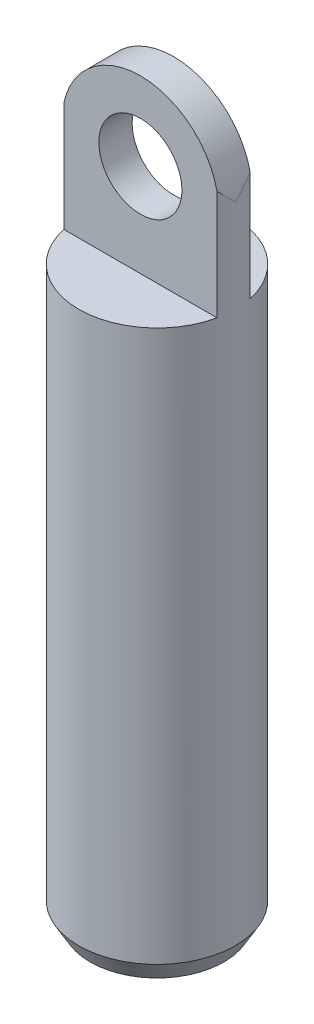
ISO-10303-21;
HEADER;
FILE_DESCRIPTION(('STEP AP214'),'2;1');
FILE_NAME('part.step','',(''),(''),'','','');
FILE_SCHEMA(('AUTOMOTIVE_DESIGN { 1 0 10303 214 1 1 1 1 }'));
ENDSEC;
DATA;
#1=APPLICATION_CONTEXT('core data for automotive mechanical design processes');
#2=APPLICATION_PROTOCOL_DEFINITION('international standard','automotive_design',2000,#1);
#3=PRODUCT_CONTEXT('',#1,'mechanical');
#4=PRODUCT('Part','Part','',(#3));
#5=PRODUCT_RELATED_PRODUCT_CATEGORY('part','',(#4));
#6=PRODUCT_DEFINITION_FORMATION('','',#4);
#7=PRODUCT_DEFINITION_CONTEXT('part definition',#1,'design');
#8=PRODUCT_DEFINITION('design','',#6,#7);
#9=PRODUCT_DEFINITION_SHAPE('','',#8);
#10=(LENGTH_UNIT() NAMED_UNIT(*) SI_UNIT(.MILLI.,.METRE.));
#11=(NAMED_UNIT(*) PLANE_ANGLE_UNIT() SI_UNIT($,.RADIAN.));
#12=(NAMED_UNIT(*) SI_UNIT($,.STERADIAN.) SOLID_ANGLE_UNIT());
#13=UNCERTAINTY_MEASURE_WITH_UNIT(LENGTH_MEASURE(1.E-05),#10,'distance_accuracy_value','');
#14=(GEOMETRIC_REPRESENTATION_CONTEXT(3) GLOBAL_UNCERTAINTY_ASSIGNED_CONTEXT((#13)) GLOBAL_UNIT_ASSIGNED_CONTEXT((#10,
#11,#12)) REPRESENTATION_CONTEXT('',''));
#15=CARTESIAN_POINT('',(0.,0.,0.));
#16=DIRECTION('',(0.,0.,1.));
#17=DIRECTION('',(1.,0.,0.));
#18=AXIS2_PLACEMENT_3D('',#15,#16,#17);
#19=CARTESIAN_POINT('',(0.,14.1986,0.));
#20=DIRECTION('',(0.,-1.,0.));
#21=DIRECTION('',(0.,0.,-1.));
#22=AXIS2_PLACEMENT_3D('',#19,#20,#21);
#23=CYLINDRICAL_SURFACE('',#22,2.9972);
#24=CARTESIAN_POINT('',(0.,-13.4366,0.));
#25=DIRECTION('',(0.,1.,0.));
#26=DIRECTION('',(0.,0.,1.));
#27=AXIS2_PLACEMENT_3D('',#24,#25,#26);
#28=CIRCLE('',#27,2.9972);
#29=CARTESIAN_POINT('',(0.,-13.4366,2.9972));
#30=VERTEX_POINT('',#29);
#31=EDGE_CURVE('E24',#30,#30,#28,.T.);
#32=ORIENTED_EDGE('',*,*,#31,.T.);
#33=EDGE_LOOP('',(#32));
#34=FACE_BOUND('',#33,.T.);
#35=DIRECTION('',(0.,-1.,0.));
#36=VECTOR('',#35,1.);
#37=CARTESIAN_POINT('',(2.92916077401019,14.1986,0.635));
#38=LINE('',#37,#36);
#39=CARTESIAN_POINT('',(2.92916077401019,11.8364,0.635));
#40=VERTEX_POINT('',#39);
#41=CARTESIAN_POINT('',(2.92916077401019,7.6454,0.635));
#42=VERTEX_POINT('',#41);
#43=EDGE_CURVE('E31',#40,#42,#38,.T.);
#44=ORIENTED_EDGE('',*,*,#43,.T.);
#45=CARTESIAN_POINT('',(0.,7.6454,0.));
#46=DIRECTION('',(0.,-1.,0.));
#47=DIRECTION('',(0.,0.,-1.));
#48=AXIS2_PLACEMENT_3D('',#45,#46,#47);
#49=CIRCLE('',#48,2.9972);
#50=CARTESIAN_POINT('',(-2.92916077401019,7.6454,0.635));
#51=VERTEX_POINT('',#50);
#52=EDGE_CURVE('E117',#42,#51,#49,.T.);
#53=ORIENTED_EDGE('',*,*,#52,.T.);
#54=DIRECTION('',(0.,-1.,0.));
#55=VECTOR('',#54,1.);
#56=CARTESIAN_POINT('',(-2.92916077401019,14.1986,0.635));
#57=LINE('',#56,#55);
#58=CARTESIAN_POINT('',(-2.92916077401019,11.8364,0.635));
#59=VERTEX_POINT('',#58);
#60=EDGE_CURVE('E92',#51,#59,#57,.F.);
#61=ORIENTED_EDGE('',*,*,#60,.T.);
#62=CARTESIAN_POINT('',(0.,11.2014,0.));
#63=DIRECTION('',(0.,-0.707106781186547,0.707106781186547));
#64=DIRECTION('',(0.,-0.707106781186547,-0.707106781186547));
#65=AXIS2_PLACEMENT_3D('',#62,#63,#64);
#66=ELLIPSE('',#65,4.23868088914464,2.9972);
#67=CARTESIAN_POINT('',(-2.9972,11.2014,0.));
#68=VERTEX_POINT('',#67);
#69=EDGE_CURVE('E103',#59,#68,#66,.T.);
#70=ORIENTED_EDGE('',*,*,#69,.T.);
#71=CARTESIAN_POINT('',(0.,11.2014,0.));
#72=DIRECTION('',(0.,-0.707106781186547,-0.707106781186547));
#73=DIRECTION('',(0.,-0.707106781186547,0.707106781186547));
#74=AXIS2_PLACEMENT_3D('',#71,#72,#73);
#75=ELLIPSE('',#74,4.23868088914464,2.9972);
#76=CARTESIAN_POINT('',(-2.92916077401019,11.8364,-0.635));
#77=VERTEX_POINT('',#76);
#78=EDGE_CURVE('E108',#68,#77,#75,.T.);
#79=ORIENTED_EDGE('',*,*,#78,.T.);
#80=DIRECTION('',(0.,-1.,0.));
#81=VECTOR('',#80,1.);
#82=CARTESIAN_POINT('',(-2.92916077401019,14.1986,-0.635));
#83=LINE('',#82,#81);
#84=CARTESIAN_POINT('',(-2.92916077401019,7.6454,-0.635));
#85=VERTEX_POINT('',#84);
#86=EDGE_CURVE('E39',#77,#85,#83,.T.);
#87=ORIENTED_EDGE('',*,*,#86,.T.);
#88=CARTESIAN_POINT('',(0.,7.6454,0.));
#89=DIRECTION('',(0.,1.,0.));
#90=DIRECTION('',(0.,0.,1.));
#91=AXIS2_PLACEMENT_3D('',#88,#89,#90);
#92=CIRCLE('',#91,2.9972);
#93=CARTESIAN_POINT('',(2.92916077401019,7.6454,-0.635));
#94=VERTEX_POINT('',#93);
#95=EDGE_CURVE('E113',#94,#85,#92,.T.);
#96=ORIENTED_EDGE('',*,*,#95,.F.);
#97=DIRECTION('',(0.,-1.,0.));
#98=VECTOR('',#97,1.);
#99=CARTESIAN_POINT('',(2.92916077401019,14.1986,-0.635));
#100=LINE('',#99,#98);
#101=CARTESIAN_POINT('',(2.92916077401019,11.8364,-0.635));
#102=VERTEX_POINT('',#101);
#103=EDGE_CURVE('E99',#94,#102,#100,.F.);
#104=ORIENTED_EDGE('',*,*,#103,.T.);
#105=CARTESIAN_POINT('',(2.9972,11.2014,0.));
#106=VERTEX_POINT('',#105);
#107=EDGE_CURVE('E107',#102,#106,#75,.T.);
#108=ORIENTED_EDGE('',*,*,#107,.T.);
#109=EDGE_CURVE('E104',#106,#40,#66,.T.);
#110=ORIENTED_EDGE('',*,*,#109,.T.);
#111=EDGE_LOOP('',(#44,#53,#61,#70,#79,#87,#96,#104,#108,#110));
#112=FACE_BOUND('',#111,.T.);
#113=ADVANCED_FACE('F16',(#34,#112),#23,.T.);
#114=CARTESIAN_POINT('',(0.,-14.1986,0.));
#115=DIRECTION('',(0.,1.,0.));
#116=DIRECTION('',(0.,0.,1.));
#117=AXIS2_PLACEMENT_3D('',#114,#115,#116);
#118=PLANE('',#117);
#119=CARTESIAN_POINT('',(0.,-14.1986,0.));
#120=DIRECTION('',(0.,-1.,0.));
#121=DIRECTION('',(0.,0.,-1.));
#122=AXIS2_PLACEMENT_3D('',#119,#120,#121);
#123=CIRCLE('',#122,1.4224);
#124=CARTESIAN_POINT('',(0.,-14.1986,-1.4224));
#125=VERTEX_POINT('',#124);
#126=EDGE_CURVE('E83',#125,#125,#123,.T.);
#127=ORIENTED_EDGE('',*,*,#126,.F.);
#128=EDGE_LOOP('',(#127));
#129=FACE_BOUND('',#128,.T.);
#130=CARTESIAN_POINT('',(0.,-14.1986,0.));
#131=DIRECTION('',(0.,1.,0.));
#132=DIRECTION('',(0.,0.,1.));
#133=AXIS2_PLACEMENT_3D('',#130,#131,#132);
#134=CIRCLE('',#133,2.55725909487751);
#135=CARTESIAN_POINT('',(0.,-14.1986,2.55725909487751));
#136=VERTEX_POINT('',#135);
#137=EDGE_CURVE('E11',#136,#136,#134,.F.);
#138=ORIENTED_EDGE('',*,*,#137,.T.);
#139=EDGE_LOOP('',(#138));
#140=FACE_BOUND('',#139,.T.);
#141=ADVANCED_FACE('F143',(#129,#140),#118,.F.);
#142=CARTESIAN_POINT('',(0.,11.2014,28.3972));
#143=DIRECTION('',(0.,0.,-1.));
#144=DIRECTION('',(-1.,0.,0.));
#145=AXIS2_PLACEMENT_3D('',#142,#143,#144);
#146=CYLINDRICAL_SURFACE('',#145,2.9972);
#147=ORIENTED_EDGE('',*,*,#69,.F.);
#148=CARTESIAN_POINT('',(0.,11.2014,0.635));
#149=DIRECTION('',(0.,0.,-1.));
#150=DIRECTION('',(-1.,0.,0.));
#151=AXIS2_PLACEMENT_3D('',#148,#149,#150);
#152=CIRCLE('',#151,2.9972);
#153=EDGE_CURVE('E115',#59,#40,#152,.T.);
#154=ORIENTED_EDGE('',*,*,#153,.T.);
#155=ORIENTED_EDGE('',*,*,#109,.F.);
#156=ORIENTED_EDGE('',*,*,#107,.F.);
#157=CARTESIAN_POINT('',(0.,11.2014,-0.635));
#158=DIRECTION('',(0.,0.,1.));
#159=DIRECTION('',(1.,0.,0.));
#160=AXIS2_PLACEMENT_3D('',#157,#158,#159);
#161=CIRCLE('',#160,2.9972);
#162=EDGE_CURVE('E111',#102,#77,#161,.T.);
#163=ORIENTED_EDGE('',*,*,#162,.T.);
#164=ORIENTED_EDGE('',*,*,#78,.F.);
#165=EDGE_LOOP('',(#147,#154,#155,#156,#163,#164));
#166=FACE_BOUND('',#165,.T.);
#167=ADVANCED_FACE('F147',(#166),#146,.T.);
#168=CARTESIAN_POINT('',(0.,7.6454,-0.635));
#169=DIRECTION('',(0.,1.,0.));
#170=DIRECTION('',(0.,0.,1.));
#171=AXIS2_PLACEMENT_3D('',#168,#169,#170);
#172=PLANE('',#171);
#173=DIRECTION('',(1.,0.,0.));
#174=VECTOR('',#173,1.);
#175=CARTESIAN_POINT('',(0.,7.6454,-0.635));
#176=LINE('',#175,#174);
#177=EDGE_CURVE('E96',#85,#94,#176,.T.);
#178=ORIENTED_EDGE('',*,*,#177,.T.);
#179=ORIENTED_EDGE('',*,*,#95,.T.);
#180=EDGE_LOOP('',(#178,#179));
#181=FACE_BOUND('',#180,.T.);
#182=ADVANCED_FACE('F153',(#181),#172,.T.);
#183=CARTESIAN_POINT('',(0.,2.96326821784253,-0.635));
#184=DIRECTION('',(0.,0.,1.));
#185=DIRECTION('',(1.,0.,0.));
#186=AXIS2_PLACEMENT_3D('',#183,#184,#185);
#187=PLANE('',#186);
#188=CARTESIAN_POINT('',(0.,11.2014,-0.635));
#189=DIRECTION('',(0.,0.,-1.));
#190=DIRECTION('',(-1.,0.,0.));
#191=AXIS2_PLACEMENT_3D('',#188,#189,#190);
#192=CIRCLE('',#191,1.5875);
#193=CARTESIAN_POINT('',(-1.5875,11.2014,-0.635));
#194=VERTEX_POINT('',#193);
#195=EDGE_CURVE('E86',#194,#194,#192,.T.);
#196=ORIENTED_EDGE('',*,*,#195,.F.);
#197=EDGE_LOOP('',(#196));
#198=FACE_BOUND('',#197,.T.);
#199=ORIENTED_EDGE('',*,*,#162,.F.);
#200=ORIENTED_EDGE('',*,*,#103,.F.);
#201=ORIENTED_EDGE('',*,*,#177,.F.);
#202=ORIENTED_EDGE('',*,*,#86,.F.);
#203=EDGE_LOOP('',(#199,#200,#201,#202));
#204=FACE_BOUND('',#203,.T.);
#205=ADVANCED_FACE('F157',(#198,#204),#187,.F.);
#206=CARTESIAN_POINT('',(0.,7.6454,0.635));
#207=DIRECTION('',(0.,-1.,0.));
#208=DIRECTION('',(0.,0.,-1.));
#209=AXIS2_PLACEMENT_3D('',#206,#207,#208);
#210=PLANE('',#209);
#211=DIRECTION('',(1.,0.,0.));
#212=VECTOR('',#211,1.);
#213=CARTESIAN_POINT('',(0.,7.6454,0.635));
#214=LINE('',#213,#212);
#215=EDGE_CURVE('E90',#51,#42,#214,.T.);
#216=ORIENTED_EDGE('',*,*,#215,.F.);
#217=ORIENTED_EDGE('',*,*,#52,.F.);
#218=EDGE_LOOP('',(#216,#217));
#219=FACE_BOUND('',#218,.T.);
#220=ADVANCED_FACE('F161',(#219),#210,.F.);
#221=CARTESIAN_POINT('',(0.,2.96326821784253,0.635));
#222=DIRECTION('',(0.,0.,-1.));
#223=DIRECTION('',(1.,0.,0.));
#224=AXIS2_PLACEMENT_3D('',#221,#222,#223);
#225=PLANE('',#224);
#226=CARTESIAN_POINT('',(0.,11.2014,0.635));
#227=DIRECTION('',(0.,0.,-1.));
#228=DIRECTION('',(-1.,0.,0.));
#229=AXIS2_PLACEMENT_3D('',#226,#227,#228);
#230=CIRCLE('',#229,1.5875);
#231=CARTESIAN_POINT('',(-1.5875,11.2014,0.635));
#232=VERTEX_POINT('',#231);
#233=EDGE_CURVE('E89',#232,#232,#230,.T.);
#234=ORIENTED_EDGE('',*,*,#233,.T.);
#235=EDGE_LOOP('',(#234));
#236=FACE_BOUND('',#235,.T.);
#237=ORIENTED_EDGE('',*,*,#153,.F.);
#238=ORIENTED_EDGE('',*,*,#60,.F.);
#239=ORIENTED_EDGE('',*,*,#215,.T.);
#240=ORIENTED_EDGE('',*,*,#43,.F.);
#241=EDGE_LOOP('',(#237,#238,#239,#240));
#242=FACE_BOUND('',#241,.T.);
#243=ADVANCED_FACE('F138',(#236,#242),#225,.F.);
#244=CARTESIAN_POINT('',(0.,11.2014,2.9972));
#245=DIRECTION('',(0.,0.,-1.));
#246=DIRECTION('',(-1.,0.,0.));
#247=AXIS2_PLACEMENT_3D('',#244,#245,#246);
#248=CYLINDRICAL_SURFACE('',#247,1.5875);
#249=CARTESIAN_POINT('',(-1.5875,11.2014,-0.635));
#250=CARTESIAN_POINT('',(-1.5875,11.2014,-0.621770833333333));
#251=CARTESIAN_POINT('',(-1.5875,11.2014,-0.608541666666667));
#252=CARTESIAN_POINT('',(-1.5875,11.2014,-0.582083333333333));
#253=CARTESIAN_POINT('',(-1.5875,11.2014,-0.568854166666666));
#254=CARTESIAN_POINT('',(-1.5875,11.2014,-0.542395833333333));
#255=CARTESIAN_POINT('',(-1.5875,11.2014,-0.529166666666666));
#256=CARTESIAN_POINT('',(-1.5875,11.2014,-0.502708333333333));
#257=CARTESIAN_POINT('',(-1.5875,11.2014,-0.489479166666666));
#258=CARTESIAN_POINT('',(-1.5875,11.2014,-0.463020833333333));
#259=CARTESIAN_POINT('',(-1.5875,11.2014,-0.449791666666666));
#260=CARTESIAN_POINT('',(-1.5875,11.2014,-0.423333333333333));
#261=CARTESIAN_POINT('',(-1.5875,11.2014,-0.410104166666666));
#262=CARTESIAN_POINT('',(-1.5875,11.2014,-0.383645833333333));
#263=CARTESIAN_POINT('',(-1.5875,11.2014,-0.370416666666666));
#264=CARTESIAN_POINT('',(-1.5875,11.2014,-0.343958333333333));
#265=CARTESIAN_POINT('',(-1.5875,11.2014,-0.330729166666666));
#266=CARTESIAN_POINT('',(-1.5875,11.2014,-0.304270833333333));
#267=CARTESIAN_POINT('',(-1.5875,11.2014,-0.291041666666666));
#268=CARTESIAN_POINT('',(-1.5875,11.2014,-0.264583333333333));
#269=CARTESIAN_POINT('',(-1.5875,11.2014,-0.251354166666667));
#270=CARTESIAN_POINT('',(-1.5875,11.2014,-0.224895833333333));
#271=CARTESIAN_POINT('',(-1.5875,11.2014,-0.211666666666667));
#272=CARTESIAN_POINT('',(-1.5875,11.2014,-0.185208333333333));
#273=CARTESIAN_POINT('',(-1.5875,11.2014,-0.171979166666667));
#274=CARTESIAN_POINT('',(-1.5875,11.2014,-0.145520833333333));
#275=CARTESIAN_POINT('',(-1.5875,11.2014,-0.132291666666667));
#276=CARTESIAN_POINT('',(-1.5875,11.2014,-0.105833333333333));
#277=CARTESIAN_POINT('',(-1.5875,11.2014,-0.0926041666666666));
#278=CARTESIAN_POINT('',(-1.5875,11.2014,-0.0661458333333334));
#279=CARTESIAN_POINT('',(-1.5875,11.2014,-0.0529166666666668));
#280=CARTESIAN_POINT('',(-1.5875,11.2014,-0.0264583333333335));
#281=CARTESIAN_POINT('',(-1.5875,11.2014,-0.0132291666666667));
#282=CARTESIAN_POINT('',(-1.5875,11.2014,0.0132291666666667));
#283=CARTESIAN_POINT('',(-1.5875,11.2014,0.0264583333333335));
#284=CARTESIAN_POINT('',(-1.5875,11.2014,0.0529166666666668));
#285=CARTESIAN_POINT('',(-1.5875,11.2014,0.0661458333333334));
#286=CARTESIAN_POINT('',(-1.5875,11.2014,0.0926041666666666));
#287=CARTESIAN_POINT('',(-1.5875,11.2014,0.105833333333333));
#288=CARTESIAN_POINT('',(-1.5875,11.2014,0.132291666666667));
#289=CARTESIAN_POINT('',(-1.5875,11.2014,0.145520833333333));
#290=CARTESIAN_POINT('',(-1.5875,11.2014,0.171979166666667));
#291=CARTESIAN_POINT('',(-1.5875,11.2014,0.185208333333333));
#292=CARTESIAN_POINT('',(-1.5875,11.2014,0.211666666666667));
#293=CARTESIAN_POINT('',(-1.5875,11.2014,0.224895833333333));
#294=CARTESIAN_POINT('',(-1.5875,11.2014,0.251354166666667));
#295=CARTESIAN_POINT('',(-1.5875,11.2014,0.264583333333333));
#296=CARTESIAN_POINT('',(-1.5875,11.2014,0.291041666666666));
#297=CARTESIAN_POINT('',(-1.5875,11.2014,0.304270833333333));
#298=CARTESIAN_POINT('',(-1.5875,11.2014,0.330729166666666));
#299=CARTESIAN_POINT('',(-1.5875,11.2014,0.343958333333333));
#300=CARTESIAN_POINT('',(-1.5875,11.2014,0.370416666666667));
#301=CARTESIAN_POINT('',(-1.5875,11.2014,0.383645833333333));
#302=CARTESIAN_POINT('',(-1.5875,11.2014,0.410104166666667));
#303=CARTESIAN_POINT('',(-1.5875,11.2014,0.423333333333333));
#304=CARTESIAN_POINT('',(-1.5875,11.2014,0.449791666666666));
#305=CARTESIAN_POINT('',(-1.5875,11.2014,0.463020833333333));
#306=CARTESIAN_POINT('',(-1.5875,11.2014,0.489479166666666));
#307=CARTESIAN_POINT('',(-1.5875,11.2014,0.502708333333333));
#308=CARTESIAN_POINT('',(-1.5875,11.2014,0.529166666666666));
#309=CARTESIAN_POINT('',(-1.5875,11.2014,0.542395833333333));
#310=CARTESIAN_POINT('',(-1.5875,11.2014,0.568854166666666));
#311=CARTESIAN_POINT('',(-1.5875,11.2014,0.582083333333333));
#312=CARTESIAN_POINT('',(-1.5875,11.2014,0.608541666666667));
#313=CARTESIAN_POINT('',(-1.5875,11.2014,0.621770833333333));
#314=CARTESIAN_POINT('',(-1.5875,11.2014,0.635));
#315=B_SPLINE_CURVE_WITH_KNOTS('',3,(#249,#250,#251,#252,#253,#254,#255,#256,#257,#258,#259,
#260,#261,#262,#263,#264,#265,#266,#267,#268,#269,#270,#271,#272,#273,#274,#275,#276,#277,#278,
#279,#280,#281,#282,#283,#284,#285,#286,#287,#288,#289,#290,#291,#292,#293,#294,#295,#296,#297,
#298,#299,#300,#301,#302,#303,#304,#305,#306,#307,#308,#309,#310,#311,#312,#313,#314),
.UNSPECIFIED.,.F.,.F.,(4,2,2,2,2,2,2,2,2,2,2,2,2,2,2,2,2,2,2,2,2,2,2,2,2,2,2,2,2,2,2,2,4),(0.,
0.0396874999999998,0.079375,0.1190625,0.15875,0.1984375,0.238125,0.2778125,0.3175,0.3571875,
0.396875,0.4365625,0.47625,0.5159375,0.555625,0.595312499999999,0.635,0.6746875,0.714375,
0.7540625,0.79375,0.833437499999999,0.873125,0.9128125,0.952499999999999,0.9921875,1.031875,
1.0715625,1.11125,1.1509375,1.190625,1.2303125,1.27),.UNSPECIFIED.);
#316=EDGE_CURVE('BSEAM128',#194,#232,#315,.T.);
#317=ORIENTED_EDGE('',*,*,#195,.T.);
#318=ORIENTED_EDGE('',*,*,#233,.F.);
#319=ORIENTED_EDGE('',*,*,#316,.T.);
#320=ORIENTED_EDGE('',*,*,#316,.F.);
#321=EDGE_LOOP('',(#317,#319,#318,#320));
#322=FACE_BOUND('',#321,.T.);
#323=ADVANCED_FACE('F128',(#322),#248,.F.);
#324=CARTESIAN_POINT('',(0.,-13.4366,0.));
#325=DIRECTION('',(0.,1.,0.));
#326=DIRECTION('',(0.,0.,1.));
#327=AXIS2_PLACEMENT_3D('',#324,#325,#326);
#328=CONICAL_SURFACE('',#327,2.9972,0.5235987755983);
#329=ORIENTED_EDGE('',*,*,#137,.F.);
#330=EDGE_LOOP('',(#329));
#331=FACE_BOUND('',#330,.T.);
#332=ORIENTED_EDGE('',*,*,#31,.F.);
#333=EDGE_LOOP('',(#332));
#334=FACE_BOUND('',#333,.T.);
#335=ADVANCED_FACE('F18',(#331,#334),#328,.T.);
#336=CARTESIAN_POINT('',(0.,-14.1986,0.));
#337=DIRECTION('',(0.,-1.,0.));
#338=DIRECTION('',(0.,0.,-1.));
#339=AXIS2_PLACEMENT_3D('',#336,#337,#338);
#340=CYLINDRICAL_SURFACE('',#339,1.4224);
#341=CARTESIAN_POINT('',(0.,-10.3886,0.));
#342=DIRECTION('',(0.,-1.,0.));
#343=DIRECTION('',(0.,0.,-1.));
#344=AXIS2_PLACEMENT_3D('',#341,#342,#343);
#345=CIRCLE('',#344,1.4224);
#346=CARTESIAN_POINT('',(0.,-10.3886,-1.4224));
#347=VERTEX_POINT('',#346);
#348=EDGE_CURVE('E78',#347,#347,#345,.T.);
#349=ORIENTED_EDGE('',*,*,#348,.F.);
#350=EDGE_LOOP('',(#349));
#351=FACE_BOUND('',#350,.T.);
#352=ORIENTED_EDGE('',*,*,#126,.T.);
#353=EDGE_LOOP('',(#352));
#354=FACE_BOUND('',#353,.T.);
#355=ADVANCED_FACE('F127',(#351,#354),#340,.F.);
#356=CARTESIAN_POINT('',(1.1303,-10.3886,0.));
#357=DIRECTION('',(0.,1.,0.));
#358=DIRECTION('',(0.,0.,1.));
#359=AXIS2_PLACEMENT_3D('',#356,#357,#358);
#360=PLANE('',#359);
#361=CARTESIAN_POINT('',(0.,-10.3886,0.));
#362=DIRECTION('',(0.,-1.,0.));
#363=DIRECTION('',(0.,0.,-1.));
#364=AXIS2_PLACEMENT_3D('',#361,#362,#363);
#365=CIRCLE('',#364,1.1303);
#366=CARTESIAN_POINT('',(0.,-10.3886,-1.1303));
#367=VERTEX_POINT('',#366);
#368=EDGE_CURVE('E75',#367,#367,#365,.T.);
#369=ORIENTED_EDGE('',*,*,#368,.F.);
#370=EDGE_LOOP('',(#369));
#371=FACE_BOUND('',#370,.T.);
#372=ORIENTED_EDGE('',*,*,#348,.T.);
#373=EDGE_LOOP('',(#372));
#374=FACE_BOUND('',#373,.T.);
#375=ADVANCED_FACE('F135',(#371,#374),#360,.F.);
#376=CARTESIAN_POINT('',(0.,-14.1986,0.));
#377=DIRECTION('',(0.,-1.,0.));
#378=DIRECTION('',(0.,0.,-1.));
#379=AXIS2_PLACEMENT_3D('',#376,#377,#378);
#380=CYLINDRICAL_SURFACE('',#379,1.1303);
#381=CARTESIAN_POINT('',(0.,-8.4836,0.));
#382=DIRECTION('',(0.,-1.,0.));
#383=DIRECTION('',(0.,0.,-1.));
#384=AXIS2_PLACEMENT_3D('',#381,#382,#383);
#385=CIRCLE('',#384,1.1303);
#386=CARTESIAN_POINT('',(0.,-8.4836,-1.1303));
#387=VERTEX_POINT('',#386);
#388=EDGE_CURVE('E73',#387,#387,#385,.T.);
#389=ORIENTED_EDGE('',*,*,#388,.F.);
#390=EDGE_LOOP('',(#389));
#391=FACE_BOUND('',#390,.T.);
#392=ORIENTED_EDGE('',*,*,#368,.T.);
#393=EDGE_LOOP('',(#392));
#394=FACE_BOUND('',#393,.T.);
#395=ADVANCED_FACE('F69',(#391,#394),#380,.F.);
#396=CARTESIAN_POINT('',(0.,-8.4836,0.));
#397=DIRECTION('',(0.,-1.,0.));
#398=DIRECTION('',(0.,0.,-1.));
#399=AXIS2_PLACEMENT_3D('',#396,#397,#398);
#400=CONICAL_SURFACE('',#399,1.1303,1.56206968053493);
#401=CARTESIAN_POINT('',(0.,-8.47373602133611,0.));
#402=VERTEX_POINT('',#401);
#403=VERTEX_LOOP('',#402);
#404=FACE_BOUND('',#403,.T.);
#405=ORIENTED_EDGE('',*,*,#388,.T.);
#406=EDGE_LOOP('',(#405));
#407=FACE_BOUND('',#406,.T.);
#408=ADVANCED_FACE('F66',(#404,#407),#400,.F.);
#409=CLOSED_SHELL('',(#113,#141,#167,#182,#205,#220,#243,#323,#335,#355,#375,#395,#408));
#410=MANIFOLD_SOLID_BREP('B1',#409);
#411=ADVANCED_BREP_SHAPE_REPRESENTATION('',(#18,#410),#14);
#412=SHAPE_DEFINITION_REPRESENTATION(#9,#411);
ENDSEC;
END-ISO-10303-21;
